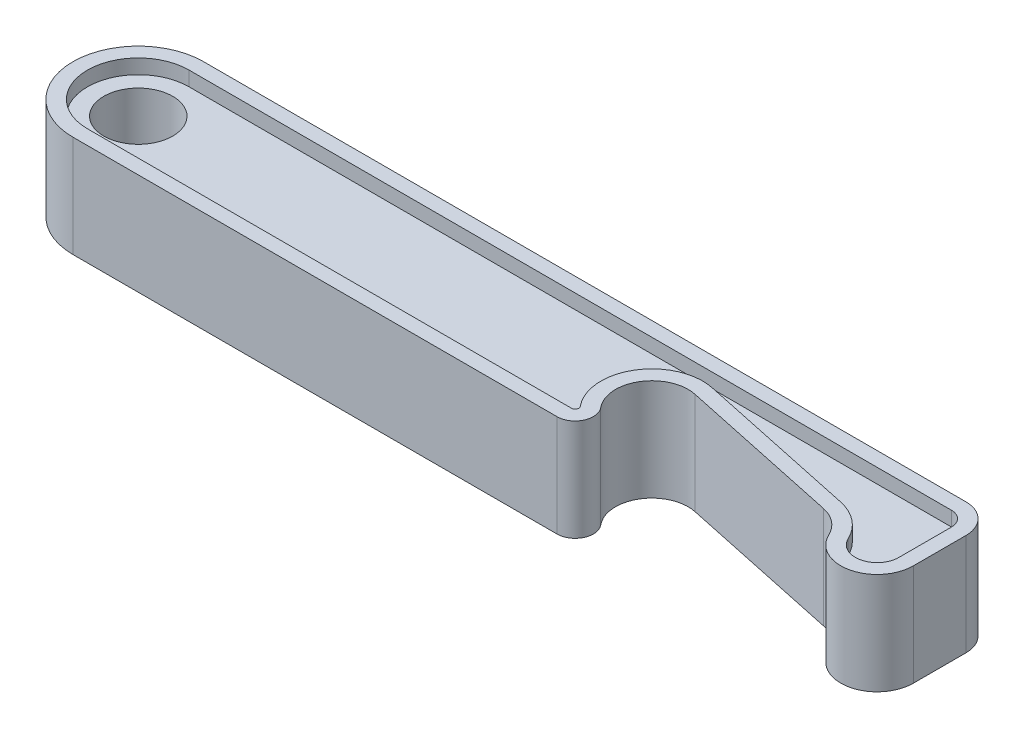
ISO-10303-21;
HEADER;
FILE_DESCRIPTION(('STEP AP214'),'2;1');
FILE_NAME('part.step','',(''),(''),'','','');
FILE_SCHEMA(('AUTOMOTIVE_DESIGN { 1 0 10303 214 1 1 1 1 }'));
ENDSEC;
DATA;
#1=APPLICATION_CONTEXT('core data for automotive mechanical design processes');
#2=APPLICATION_PROTOCOL_DEFINITION('international standard','automotive_design',2000,#1);
#3=PRODUCT_CONTEXT('',#1,'mechanical');
#4=PRODUCT('Part','Part','',(#3));
#5=PRODUCT_RELATED_PRODUCT_CATEGORY('part','',(#4));
#6=PRODUCT_DEFINITION_FORMATION('','',#4);
#7=PRODUCT_DEFINITION_CONTEXT('part definition',#1,'design');
#8=PRODUCT_DEFINITION('design','',#6,#7);
#9=PRODUCT_DEFINITION_SHAPE('','',#8);
#10=(LENGTH_UNIT() NAMED_UNIT(*) SI_UNIT(.MILLI.,.METRE.));
#11=(NAMED_UNIT(*) PLANE_ANGLE_UNIT() SI_UNIT($,.RADIAN.));
#12=(NAMED_UNIT(*) SI_UNIT($,.STERADIAN.) SOLID_ANGLE_UNIT());
#13=UNCERTAINTY_MEASURE_WITH_UNIT(LENGTH_MEASURE(1.E-05),#10,'distance_accuracy_value','');
#14=(GEOMETRIC_REPRESENTATION_CONTEXT(3) GLOBAL_UNCERTAINTY_ASSIGNED_CONTEXT((#13)) GLOBAL_UNIT_ASSIGNED_CONTEXT((#10,
#11,#12)) REPRESENTATION_CONTEXT('',''));
#15=CARTESIAN_POINT('',(0.,0.,0.));
#16=DIRECTION('',(0.,0.,1.));
#17=DIRECTION('',(1.,0.,0.));
#18=AXIS2_PLACEMENT_3D('',#15,#16,#17);
#19=CARTESIAN_POINT('',(-50.,7.,0.));
#20=DIRECTION('',(0.,-1.,0.));
#21=DIRECTION('',(0.,0.,-1.));
#22=AXIS2_PLACEMENT_3D('',#19,#20,#21);
#23=CYLINDRICAL_SURFACE('',#22,7.);
#24=DIRECTION('',(0.,-1.,0.));
#25=VECTOR('',#24,1.);
#26=CARTESIAN_POINT('',(-50.,7.,-7.));
#27=LINE('',#26,#25);
#28=CARTESIAN_POINT('',(-50.,-5.,-7.));
#29=VERTEX_POINT('',#28);
#30=CARTESIAN_POINT('',(-50.,-7.,-7.));
#31=VERTEX_POINT('',#30);
#32=EDGE_CURVE('E473',#29,#31,#27,.T.);
#33=ORIENTED_EDGE('',*,*,#32,.F.);
#34=CARTESIAN_POINT('',(-50.,-5.,0.));
#35=DIRECTION('',(0.,1.,0.));
#36=DIRECTION('',(0.,0.,1.));
#37=AXIS2_PLACEMENT_3D('',#34,#35,#36);
#38=CIRCLE('',#37,7.);
#39=CARTESIAN_POINT('',(-50.,-5.,7.));
#40=VERTEX_POINT('',#39);
#41=EDGE_CURVE('E291',#29,#40,#38,.T.);
#42=ORIENTED_EDGE('',*,*,#41,.T.);
#43=DIRECTION('',(0.,-1.,0.));
#44=VECTOR('',#43,1.);
#45=CARTESIAN_POINT('',(-50.,7.,7.));
#46=LINE('',#45,#44);
#47=CARTESIAN_POINT('',(-50.,-7.,7.));
#48=VERTEX_POINT('',#47);
#49=EDGE_CURVE('E369',#40,#48,#46,.T.);
#50=ORIENTED_EDGE('',*,*,#49,.T.);
#51=CARTESIAN_POINT('',(-50.,-7.,0.));
#52=DIRECTION('',(0.,1.,0.));
#53=DIRECTION('',(0.,0.,1.));
#54=AXIS2_PLACEMENT_3D('',#51,#52,#53);
#55=CIRCLE('',#54,7.);
#56=EDGE_CURVE('E285',#31,#48,#55,.T.);
#57=ORIENTED_EDGE('',*,*,#56,.F.);
#58=EDGE_LOOP('',(#33,#42,#50,#57));
#59=FACE_BOUND('',#58,.T.);
#60=ADVANCED_FACE('F45',(#59),#23,.F.);
#61=CARTESIAN_POINT('',(0.,7.,-7.));
#62=DIRECTION('',(0.,0.,-1.));
#63=DIRECTION('',(-1.,0.,0.));
#64=AXIS2_PLACEMENT_3D('',#61,#62,#63);
#65=PLANE('',#64);
#66=DIRECTION('',(1.,0.,0.));
#67=VECTOR('',#66,1.);
#68=CARTESIAN_POINT('',(0.,-5.,-7.));
#69=LINE('',#68,#67);
#70=CARTESIAN_POINT('',(55.,-5.,-7.));
#71=VERTEX_POINT('',#70);
#72=EDGE_CURVE('E289',#29,#71,#69,.T.);
#73=ORIENTED_EDGE('',*,*,#72,.F.);
#74=ORIENTED_EDGE('',*,*,#32,.T.);
#75=DIRECTION('',(1.,0.,0.));
#76=VECTOR('',#75,1.);
#77=CARTESIAN_POINT('',(0.,-7.,-7.));
#78=LINE('',#77,#76);
#79=CARTESIAN_POINT('',(55.,-7.,-7.));
#80=VERTEX_POINT('',#79);
#81=EDGE_CURVE('E372',#31,#80,#78,.T.);
#82=ORIENTED_EDGE('',*,*,#81,.T.);
#83=DIRECTION('',(0.,-1.,0.));
#84=VECTOR('',#83,1.);
#85=CARTESIAN_POINT('',(55.,7.,-7.));
#86=LINE('',#85,#84);
#87=EDGE_CURVE('E471',#71,#80,#86,.T.);
#88=ORIENTED_EDGE('',*,*,#87,.F.);
#89=EDGE_LOOP('',(#73,#74,#82,#88));
#90=FACE_BOUND('',#89,.T.);
#91=ADVANCED_FACE('F483',(#90),#65,.F.);
#92=CARTESIAN_POINT('',(55.,7.,-5.));
#93=DIRECTION('',(0.,-1.,0.));
#94=DIRECTION('',(0.,0.,-1.));
#95=AXIS2_PLACEMENT_3D('',#92,#93,#94);
#96=CYLINDRICAL_SURFACE('',#95,2.);
#97=DIRECTION('',(0.,-1.,0.));
#98=VECTOR('',#97,1.);
#99=CARTESIAN_POINT('',(57.,7.,-5.));
#100=LINE('',#99,#98);
#101=CARTESIAN_POINT('',(57.,-5.,-5.));
#102=VERTEX_POINT('',#101);
#103=CARTESIAN_POINT('',(57.,-7.,-5.));
#104=VERTEX_POINT('',#103);
#105=EDGE_CURVE('E468',#102,#104,#100,.T.);
#106=ORIENTED_EDGE('',*,*,#105,.F.);
#107=CARTESIAN_POINT('',(55.,-5.,-5.));
#108=DIRECTION('',(0.,1.,0.));
#109=DIRECTION('',(0.,0.,1.));
#110=AXIS2_PLACEMENT_3D('',#107,#108,#109);
#111=CIRCLE('',#110,2.);
#112=EDGE_CURVE('E313',#102,#71,#111,.T.);
#113=ORIENTED_EDGE('',*,*,#112,.T.);
#114=ORIENTED_EDGE('',*,*,#87,.T.);
#115=CARTESIAN_POINT('',(55.,-7.,-5.));
#116=DIRECTION('',(0.,1.,0.));
#117=DIRECTION('',(0.,0.,1.));
#118=AXIS2_PLACEMENT_3D('',#115,#116,#117);
#119=CIRCLE('',#118,2.);
#120=EDGE_CURVE('E375',#104,#80,#119,.T.);
#121=ORIENTED_EDGE('',*,*,#120,.F.);
#122=EDGE_LOOP('',(#106,#113,#114,#121));
#123=FACE_BOUND('',#122,.T.);
#124=ADVANCED_FACE('F479',(#123),#96,.F.);
#125=CARTESIAN_POINT('',(57.,7.,0.));
#126=DIRECTION('',(1.,0.,0.));
#127=DIRECTION('',(0.,0.,-1.));
#128=AXIS2_PLACEMENT_3D('',#125,#126,#127);
#129=PLANE('',#128);
#130=DIRECTION('',(0.,0.,1.));
#131=VECTOR('',#130,1.);
#132=CARTESIAN_POINT('',(57.,-5.,0.));
#133=LINE('',#132,#131);
#134=CARTESIAN_POINT('',(57.,-5.,2.24951352484519));
#135=VERTEX_POINT('',#134);
#136=EDGE_CURVE('E311',#102,#135,#133,.T.);
#137=ORIENTED_EDGE('',*,*,#136,.F.);
#138=ORIENTED_EDGE('',*,*,#105,.T.);
#139=DIRECTION('',(0.,0.,1.));
#140=VECTOR('',#139,1.);
#141=CARTESIAN_POINT('',(57.,-7.,0.));
#142=LINE('',#141,#140);
#143=CARTESIAN_POINT('',(57.,-7.,2.24951352484519));
#144=VERTEX_POINT('',#143);
#145=EDGE_CURVE('E378',#104,#144,#142,.T.);
#146=ORIENTED_EDGE('',*,*,#145,.T.);
#147=DIRECTION('',(0.,-1.,0.));
#148=VECTOR('',#147,1.);
#149=CARTESIAN_POINT('',(57.,7.,2.24951352484519));
#150=LINE('',#149,#148);
#151=EDGE_CURVE('E464',#135,#144,#150,.T.);
#152=ORIENTED_EDGE('',*,*,#151,.F.);
#153=EDGE_LOOP('',(#137,#138,#146,#152));
#154=FACE_BOUND('',#153,.T.);
#155=ADVANCED_FACE('F495',(#154),#129,.F.);
#156=CARTESIAN_POINT('',(54.,7.,2.24951352484519));
#157=DIRECTION('',(0.,-1.,0.));
#158=DIRECTION('',(0.,0.,-1.));
#159=AXIS2_PLACEMENT_3D('',#156,#157,#158);
#160=CYLINDRICAL_SURFACE('',#159,3.00000000000001);
#161=DIRECTION('',(0.,-1.,0.));
#162=VECTOR('',#161,1.);
#163=CARTESIAN_POINT('',(51.284488478167,7.,3.52465946739163));
#164=LINE('',#163,#162);
#165=CARTESIAN_POINT('',(51.284488478167,-5.,3.52465946739163));
#166=VERTEX_POINT('',#165);
#167=CARTESIAN_POINT('',(51.284488478167,-7.,3.52465946739163));
#168=VERTEX_POINT('',#167);
#169=EDGE_CURVE('E460',#166,#168,#164,.T.);
#170=ORIENTED_EDGE('',*,*,#169,.F.);
#171=CARTESIAN_POINT('',(54.,-5.,2.24951352484519));
#172=DIRECTION('',(0.,1.,0.));
#173=DIRECTION('',(0.,0.,1.));
#174=AXIS2_PLACEMENT_3D('',#171,#172,#173);
#175=CIRCLE('',#174,3.00000000000001);
#176=EDGE_CURVE('E308',#166,#135,#175,.T.);
#177=ORIENTED_EDGE('',*,*,#176,.T.);
#178=ORIENTED_EDGE('',*,*,#151,.T.);
#179=CARTESIAN_POINT('',(54.,-7.,2.24951352484519));
#180=DIRECTION('',(0.,1.,0.));
#181=DIRECTION('',(0.,0.,1.));
#182=AXIS2_PLACEMENT_3D('',#179,#180,#181);
#183=CIRCLE('',#182,3.00000000000001);
#184=EDGE_CURVE('E381',#168,#144,#183,.T.);
#185=ORIENTED_EDGE('',*,*,#184,.F.);
#186=EDGE_LOOP('',(#170,#177,#178,#185));
#187=FACE_BOUND('',#186,.T.);
#188=ADVANCED_FACE('F501',(#187),#160,.F.);
#189=CARTESIAN_POINT('',(44.9482949272236,7.,6.5));
#190=DIRECTION('',(0.,-1.,0.));
#191=DIRECTION('',(0.,0.,-1.));
#192=AXIS2_PLACEMENT_3D('',#189,#190,#191);
#193=CYLINDRICAL_SURFACE('',#192,7.);
#194=CARTESIAN_POINT('',(44.9482949272236,-5.,6.5));
#195=DIRECTION('',(0.,1.,0.));
#196=DIRECTION('',(0.,0.,1.));
#197=AXIS2_PLACEMENT_3D('',#194,#195,#196);
#198=CIRCLE('',#197,7.);
#199=CARTESIAN_POINT('',(46.4036767629479,-5.,-0.347033205136637));
#200=VERTEX_POINT('',#199);
#201=EDGE_CURVE('E306',#166,#200,#198,.T.);
#202=ORIENTED_EDGE('',*,*,#201,.F.);
#203=ORIENTED_EDGE('',*,*,#169,.T.);
#204=CARTESIAN_POINT('',(44.9482949272236,-7.,6.5));
#205=DIRECTION('',(0.,1.,0.));
#206=DIRECTION('',(0.,0.,1.));
#207=AXIS2_PLACEMENT_3D('',#204,#205,#206);
#208=CIRCLE('',#207,7.);
#209=CARTESIAN_POINT('',(46.4036767629479,-7.,-0.347033205136637));
#210=VERTEX_POINT('',#209);
#211=EDGE_CURVE('E384',#168,#210,#208,.T.);
#212=ORIENTED_EDGE('',*,*,#211,.T.);
#213=DIRECTION('',(0.,-1.,0.));
#214=VECTOR('',#213,1.);
#215=CARTESIAN_POINT('',(46.4036767629479,7.,-0.347033205136637));
#216=LINE('',#215,#214);
#217=EDGE_CURVE('E456',#200,#210,#216,.T.);
#218=ORIENTED_EDGE('',*,*,#217,.F.);
#219=EDGE_LOOP('',(#202,#203,#212,#218));
#220=FACE_BOUND('',#219,.T.);
#221=ADVANCED_FACE('F503',(#220),#193,.T.);
#222=CARTESIAN_POINT('',(2.07647987956723,7.,-9.76906976313817));
#223=DIRECTION('',(0.20791169081776,0.,-0.978147600733806));
#224=DIRECTION('',(-0.978147600733806,0.,-0.20791169081776));
#225=AXIS2_PLACEMENT_3D('',#222,#223,#224);
#226=PLANE('',#225);
#227=DIRECTION('',(0.,-1.,0.));
#228=VECTOR('',#227,1.);
#229=CARTESIAN_POINT('',(23.9036767629479,7.,-5.12955584271215));
#230=LINE('',#229,#228);
#231=CARTESIAN_POINT('',(23.9036767629479,-5.,-5.12955584271215));
#232=VERTEX_POINT('',#231);
#233=CARTESIAN_POINT('',(23.9036767629479,-7.,-5.12955584271215));
#234=VERTEX_POINT('',#233);
#235=EDGE_CURVE('E452',#232,#234,#230,.T.);
#236=ORIENTED_EDGE('',*,*,#235,.F.);
#237=DIRECTION('',(0.978147600733806,0.,0.20791169081776));
#238=VECTOR('',#237,1.);
#239=CARTESIAN_POINT('',(2.07647987956723,-5.,-9.76906976313817));
#240=LINE('',#239,#238);
#241=EDGE_CURVE('E303',#232,#200,#240,.T.);
#242=ORIENTED_EDGE('',*,*,#241,.T.);
#243=ORIENTED_EDGE('',*,*,#217,.T.);
#244=DIRECTION('',(0.978147600733806,0.,0.20791169081776));
#245=VECTOR('',#244,1.);
#246=CARTESIAN_POINT('',(2.07647987956723,-7.,-9.76906976313817));
#247=LINE('',#246,#245);
#248=EDGE_CURVE('E387',#234,#210,#247,.T.);
#249=ORIENTED_EDGE('',*,*,#248,.F.);
#250=EDGE_LOOP('',(#236,#242,#243,#249));
#251=FACE_BOUND('',#250,.T.);
#252=ADVANCED_FACE('F509',(#251),#226,.T.);
#253=CARTESIAN_POINT('',(22.4482949272236,7.,1.71747736242449));
#254=DIRECTION('',(0.,-1.,0.));
#255=DIRECTION('',(0.,0.,-1.));
#256=AXIS2_PLACEMENT_3D('',#253,#254,#255);
#257=CYLINDRICAL_SURFACE('',#256,7.);
#258=DIRECTION('',(0.,-1.,0.));
#259=VECTOR('',#258,1.);
#260=CARTESIAN_POINT('',(17.0561254873655,7.,6.18116515749496));
#261=LINE('',#260,#259);
#262=CARTESIAN_POINT('',(17.0561254873655,-5.,6.18116515749496));
#263=VERTEX_POINT('',#262);
#264=CARTESIAN_POINT('',(17.0561254873655,-7.,6.18116515749496));
#265=VERTEX_POINT('',#264);
#266=EDGE_CURVE('E254',#263,#265,#261,.T.);
#267=ORIENTED_EDGE('',*,*,#266,.F.);
#268=CARTESIAN_POINT('',(22.4482949272236,-5.,1.71747736242449));
#269=DIRECTION('',(0.,1.,0.));
#270=DIRECTION('',(0.,0.,1.));
#271=AXIS2_PLACEMENT_3D('',#268,#269,#270);
#272=CIRCLE('',#271,7.);
#273=EDGE_CURVE('E300',#263,#232,#272,.F.);
#274=ORIENTED_EDGE('',*,*,#273,.T.);
#275=ORIENTED_EDGE('',*,*,#235,.T.);
#276=CARTESIAN_POINT('',(22.4482949272236,-7.,1.71747736242449));
#277=DIRECTION('',(0.,1.,0.));
#278=DIRECTION('',(0.,0.,1.));
#279=AXIS2_PLACEMENT_3D('',#276,#277,#278);
#280=CIRCLE('',#279,7.);
#281=EDGE_CURVE('E390',#265,#234,#280,.F.);
#282=ORIENTED_EDGE('',*,*,#281,.F.);
#283=EDGE_LOOP('',(#267,#274,#275,#282));
#284=FACE_BOUND('',#283,.T.);
#285=ADVANCED_FACE('F512',(#284),#257,.T.);
#286=CARTESIAN_POINT('',(16.6709705273757,7.,6.5));
#287=DIRECTION('',(0.,-1.,0.));
#288=DIRECTION('',(0.,0.,-1.));
#289=AXIS2_PLACEMENT_3D('',#286,#287,#288);
#290=CYLINDRICAL_SURFACE('',#289,0.500000000000001);
#291=DIRECTION('',(0.,-1.,0.));
#292=VECTOR('',#291,1.);
#293=CARTESIAN_POINT('',(16.6709705273757,7.,7.));
#294=LINE('',#293,#292);
#295=CARTESIAN_POINT('',(16.6709705273757,-5.,7.));
#296=VERTEX_POINT('',#295);
#297=CARTESIAN_POINT('',(16.6709705273757,-7.,7.));
#298=VERTEX_POINT('',#297);
#299=EDGE_CURVE('E255',#296,#298,#294,.T.);
#300=ORIENTED_EDGE('',*,*,#299,.F.);
#301=CARTESIAN_POINT('',(16.6709705273757,-5.,6.5));
#302=DIRECTION('',(0.,1.,0.));
#303=DIRECTION('',(0.,0.,1.));
#304=AXIS2_PLACEMENT_3D('',#301,#302,#303);
#305=CIRCLE('',#304,0.500000000000001);
#306=EDGE_CURVE('E297',#296,#263,#305,.T.);
#307=ORIENTED_EDGE('',*,*,#306,.T.);
#308=ORIENTED_EDGE('',*,*,#266,.T.);
#309=CARTESIAN_POINT('',(16.6709705273757,-7.,6.5));
#310=DIRECTION('',(0.,1.,0.));
#311=DIRECTION('',(0.,0.,1.));
#312=AXIS2_PLACEMENT_3D('',#309,#310,#311);
#313=CIRCLE('',#312,0.500000000000001);
#314=EDGE_CURVE('E393',#298,#265,#313,.T.);
#315=ORIENTED_EDGE('',*,*,#314,.F.);
#316=EDGE_LOOP('',(#300,#307,#308,#315));
#317=FACE_BOUND('',#316,.T.);
#318=ADVANCED_FACE('F516',(#317),#290,.F.);
#319=CARTESIAN_POINT('',(0.,7.,7.));
#320=DIRECTION('',(0.,0.,-1.));
#321=DIRECTION('',(-1.,0.,0.));
#322=AXIS2_PLACEMENT_3D('',#319,#320,#321);
#323=PLANE('',#322);
#324=ORIENTED_EDGE('',*,*,#49,.F.);
#325=DIRECTION('',(1.,0.,0.));
#326=VECTOR('',#325,1.);
#327=CARTESIAN_POINT('',(0.,-5.,7.));
#328=LINE('',#327,#326);
#329=EDGE_CURVE('E294',#40,#296,#328,.T.);
#330=ORIENTED_EDGE('',*,*,#329,.T.);
#331=ORIENTED_EDGE('',*,*,#299,.T.);
#332=DIRECTION('',(1.,0.,0.));
#333=VECTOR('',#332,1.);
#334=CARTESIAN_POINT('',(0.,-7.,7.));
#335=LINE('',#334,#333);
#336=EDGE_CURVE('E396',#48,#298,#335,.T.);
#337=ORIENTED_EDGE('',*,*,#336,.F.);
#338=EDGE_LOOP('',(#324,#330,#331,#337));
#339=FACE_BOUND('',#338,.T.);
#340=ADVANCED_FACE('F519',(#339),#323,.T.);
#341=CARTESIAN_POINT('',(44.9482949272236,7.,6.5));
#342=DIRECTION('',(0.,-1.,0.));
#343=DIRECTION('',(0.,0.,-1.));
#344=AXIS2_PLACEMENT_3D('',#341,#342,#343);
#345=CYLINDRICAL_SURFACE('',#344,5.);
#346=CARTESIAN_POINT('',(44.9482949272236,-7.,6.5));
#347=DIRECTION('',(0.,1.,0.));
#348=DIRECTION('',(0.,0.,1.));
#349=AXIS2_PLACEMENT_3D('',#346,#347,#348);
#350=CIRCLE('',#349,5.);
#351=CARTESIAN_POINT('',(49.4741474636118,-7.,4.3747567624226));
#352=VERTEX_POINT('',#351);
#353=CARTESIAN_POINT('',(45.9878533813124,-7.,1.60926199633097));
#354=VERTEX_POINT('',#353);
#355=EDGE_CURVE('E399',#352,#354,#350,.T.);
#356=ORIENTED_EDGE('',*,*,#355,.F.);
#357=DIRECTION('',(0.,-1.,0.));
#358=VECTOR('',#357,1.);
#359=CARTESIAN_POINT('',(49.4741474636118,7.,4.3747567624226));
#360=LINE('',#359,#358);
#361=CARTESIAN_POINT('',(49.4741474636118,7.,4.3747567624226));
#362=VERTEX_POINT('',#361);
#363=EDGE_CURVE('E11',#362,#352,#360,.T.);
#364=ORIENTED_EDGE('',*,*,#363,.F.);
#365=CARTESIAN_POINT('',(44.9482949272236,7.,6.5));
#366=DIRECTION('',(0.,1.,0.));
#367=DIRECTION('',(0.,0.,1.));
#368=AXIS2_PLACEMENT_3D('',#365,#366,#367);
#369=CIRCLE('',#368,5.);
#370=CARTESIAN_POINT('',(45.9878533813124,7.,1.60926199633097));
#371=VERTEX_POINT('',#370);
#372=EDGE_CURVE('E342',#362,#371,#369,.T.);
#373=ORIENTED_EDGE('',*,*,#372,.T.);
#374=DIRECTION('',(0.,-1.,0.));
#375=VECTOR('',#374,1.);
#376=CARTESIAN_POINT('',(45.9878533813124,7.,1.60926199633097));
#377=LINE('',#376,#375);
#378=EDGE_CURVE('E428',#371,#354,#377,.T.);
#379=ORIENTED_EDGE('',*,*,#378,.T.);
#380=EDGE_LOOP('',(#356,#364,#373,#379));
#381=FACE_BOUND('',#380,.T.);
#382=ADVANCED_FACE('F572',(#381),#345,.F.);
#383=CARTESIAN_POINT('',(54.,7.,2.24951352484519));
#384=DIRECTION('',(0.,-1.,0.));
#385=DIRECTION('',(0.,0.,-1.));
#386=AXIS2_PLACEMENT_3D('',#383,#384,#385);
#387=CYLINDRICAL_SURFACE('',#386,5.00000000000001);
#388=CARTESIAN_POINT('',(54.,-7.,2.24951352484519));
#389=DIRECTION('',(0.,1.,0.));
#390=DIRECTION('',(0.,0.,1.));
#391=AXIS2_PLACEMENT_3D('',#388,#389,#390);
#392=CIRCLE('',#391,5.00000000000001);
#393=CARTESIAN_POINT('',(59.,-7.,2.24951352484519));
#394=VERTEX_POINT('',#393);
#395=EDGE_CURVE('E402',#352,#394,#392,.T.);
#396=ORIENTED_EDGE('',*,*,#395,.T.);
#397=DIRECTION('',(0.,-1.,0.));
#398=VECTOR('',#397,1.);
#399=CARTESIAN_POINT('',(59.,7.,2.24951352484519));
#400=LINE('',#399,#398);
#401=CARTESIAN_POINT('',(59.,7.,2.24951352484519));
#402=VERTEX_POINT('',#401);
#403=EDGE_CURVE('E54',#402,#394,#400,.T.);
#404=ORIENTED_EDGE('',*,*,#403,.F.);
#405=CARTESIAN_POINT('',(54.,7.,2.24951352484519));
#406=DIRECTION('',(0.,1.,0.));
#407=DIRECTION('',(0.,0.,1.));
#408=AXIS2_PLACEMENT_3D('',#405,#406,#407);
#409=CIRCLE('',#408,5.00000000000001);
#410=EDGE_CURVE('E345',#362,#402,#409,.T.);
#411=ORIENTED_EDGE('',*,*,#410,.F.);
#412=ORIENTED_EDGE('',*,*,#363,.T.);
#413=EDGE_LOOP('',(#396,#404,#411,#412));
#414=FACE_BOUND('',#413,.T.);
#415=ADVANCED_FACE('F568',(#414),#387,.T.);
#416=CARTESIAN_POINT('',(59.,7.,0.));
#417=DIRECTION('',(1.,0.,0.));
#418=DIRECTION('',(0.,0.,-1.));
#419=AXIS2_PLACEMENT_3D('',#416,#417,#418);
#420=PLANE('',#419);
#421=DIRECTION('',(0.,0.,1.));
#422=VECTOR('',#421,1.);
#423=CARTESIAN_POINT('',(59.,-7.,0.));
#424=LINE('',#423,#422);
#425=CARTESIAN_POINT('',(59.,-7.,-5.));
#426=VERTEX_POINT('',#425);
#427=EDGE_CURVE('E405',#426,#394,#424,.T.);
#428=ORIENTED_EDGE('',*,*,#427,.F.);
#429=DIRECTION('',(0.,-1.,0.));
#430=VECTOR('',#429,1.);
#431=CARTESIAN_POINT('',(59.,7.,-5.));
#432=LINE('',#431,#430);
#433=CARTESIAN_POINT('',(59.,7.,-5.));
#434=VERTEX_POINT('',#433);
#435=EDGE_CURVE('E446',#434,#426,#432,.T.);
#436=ORIENTED_EDGE('',*,*,#435,.F.);
#437=DIRECTION('',(0.,0.,1.));
#438=VECTOR('',#437,1.);
#439=CARTESIAN_POINT('',(59.,7.,0.));
#440=LINE('',#439,#438);
#441=EDGE_CURVE('E347',#434,#402,#440,.T.);
#442=ORIENTED_EDGE('',*,*,#441,.T.);
#443=ORIENTED_EDGE('',*,*,#403,.T.);
#444=EDGE_LOOP('',(#428,#436,#442,#443));
#445=FACE_BOUND('',#444,.T.);
#446=ADVANCED_FACE('F564',(#445),#420,.T.);
#447=CARTESIAN_POINT('',(55.,7.,-5.));
#448=DIRECTION('',(0.,-1.,0.));
#449=DIRECTION('',(0.,0.,-1.));
#450=AXIS2_PLACEMENT_3D('',#447,#448,#449);
#451=CYLINDRICAL_SURFACE('',#450,4.);
#452=CARTESIAN_POINT('',(55.,-7.,-5.));
#453=DIRECTION('',(0.,1.,0.));
#454=DIRECTION('',(0.,0.,1.));
#455=AXIS2_PLACEMENT_3D('',#452,#453,#454);
#456=CIRCLE('',#455,4.);
#457=CARTESIAN_POINT('',(55.,-7.,-9.));
#458=VERTEX_POINT('',#457);
#459=EDGE_CURVE('E408',#426,#458,#456,.T.);
#460=ORIENTED_EDGE('',*,*,#459,.T.);
#461=DIRECTION('',(0.,-1.,0.));
#462=VECTOR('',#461,1.);
#463=CARTESIAN_POINT('',(55.,7.,-9.));
#464=LINE('',#463,#462);
#465=CARTESIAN_POINT('',(55.,7.,-9.));
#466=VERTEX_POINT('',#465);
#467=EDGE_CURVE('E444',#466,#458,#464,.T.);
#468=ORIENTED_EDGE('',*,*,#467,.F.);
#469=CARTESIAN_POINT('',(55.,7.,-5.));
#470=DIRECTION('',(0.,1.,0.));
#471=DIRECTION('',(0.,0.,1.));
#472=AXIS2_PLACEMENT_3D('',#469,#470,#471);
#473=CIRCLE('',#472,4.);
#474=EDGE_CURVE('E350',#434,#466,#473,.T.);
#475=ORIENTED_EDGE('',*,*,#474,.F.);
#476=ORIENTED_EDGE('',*,*,#435,.T.);
#477=EDGE_LOOP('',(#460,#468,#475,#476));
#478=FACE_BOUND('',#477,.T.);
#479=ADVANCED_FACE('F560',(#478),#451,.T.);
#480=CARTESIAN_POINT('',(0.,7.,-9.));
#481=DIRECTION('',(0.,0.,-1.));
#482=DIRECTION('',(-1.,0.,0.));
#483=AXIS2_PLACEMENT_3D('',#480,#481,#482);
#484=PLANE('',#483);
#485=DIRECTION('',(1.,0.,0.));
#486=VECTOR('',#485,1.);
#487=CARTESIAN_POINT('',(0.,-7.,-9.));
#488=LINE('',#487,#486);
#489=CARTESIAN_POINT('',(-50.,-7.,-9.));
#490=VERTEX_POINT('',#489);
#491=EDGE_CURVE('E411',#490,#458,#488,.T.);
#492=ORIENTED_EDGE('',*,*,#491,.F.);
#493=DIRECTION('',(0.,-1.,0.));
#494=VECTOR('',#493,1.);
#495=CARTESIAN_POINT('',(-50.,7.,-9.));
#496=LINE('',#495,#494);
#497=CARTESIAN_POINT('',(-50.,7.,-9.));
#498=VERTEX_POINT('',#497);
#499=EDGE_CURVE('E442',#498,#490,#496,.T.);
#500=ORIENTED_EDGE('',*,*,#499,.F.);
#501=DIRECTION('',(1.,0.,0.));
#502=VECTOR('',#501,1.);
#503=CARTESIAN_POINT('',(0.,7.,-9.));
#504=LINE('',#503,#502);
#505=EDGE_CURVE('E352',#498,#466,#504,.T.);
#506=ORIENTED_EDGE('',*,*,#505,.T.);
#507=ORIENTED_EDGE('',*,*,#467,.T.);
#508=EDGE_LOOP('',(#492,#500,#506,#507));
#509=FACE_BOUND('',#508,.T.);
#510=ADVANCED_FACE('F556',(#509),#484,.T.);
#511=CARTESIAN_POINT('',(-50.,7.,0.));
#512=DIRECTION('',(0.,-1.,0.));
#513=DIRECTION('',(0.,0.,-1.));
#514=AXIS2_PLACEMENT_3D('',#511,#512,#513);
#515=CYLINDRICAL_SURFACE('',#514,9.);
#516=CARTESIAN_POINT('',(-50.,-7.,0.));
#517=DIRECTION('',(0.,1.,0.));
#518=DIRECTION('',(0.,0.,1.));
#519=AXIS2_PLACEMENT_3D('',#516,#517,#518);
#520=CIRCLE('',#519,9.);
#521=CARTESIAN_POINT('',(-50.,-7.,9.));
#522=VERTEX_POINT('',#521);
#523=EDGE_CURVE('E414',#490,#522,#520,.T.);
#524=ORIENTED_EDGE('',*,*,#523,.T.);
#525=DIRECTION('',(0.,-1.,0.));
#526=VECTOR('',#525,1.);
#527=CARTESIAN_POINT('',(-50.,7.,9.));
#528=LINE('',#527,#526);
#529=CARTESIAN_POINT('',(-50.,7.,9.));
#530=VERTEX_POINT('',#529);
#531=EDGE_CURVE('E439',#530,#522,#528,.T.);
#532=ORIENTED_EDGE('',*,*,#531,.F.);
#533=CARTESIAN_POINT('',(-50.,7.,0.));
#534=DIRECTION('',(0.,1.,0.));
#535=DIRECTION('',(0.,0.,1.));
#536=AXIS2_PLACEMENT_3D('',#533,#534,#535);
#537=CIRCLE('',#536,9.);
#538=EDGE_CURVE('E355',#498,#530,#537,.T.);
#539=ORIENTED_EDGE('',*,*,#538,.F.);
#540=ORIENTED_EDGE('',*,*,#499,.T.);
#541=EDGE_LOOP('',(#524,#532,#539,#540));
#542=FACE_BOUND('',#541,.T.);
#543=ADVANCED_FACE('F552',(#542),#515,.T.);
#544=CARTESIAN_POINT('',(0.,7.,9.));
#545=DIRECTION('',(0.,0.,-1.));
#546=DIRECTION('',(-1.,0.,0.));
#547=AXIS2_PLACEMENT_3D('',#544,#545,#546);
#548=PLANE('',#547);
#549=DIRECTION('',(1.,0.,0.));
#550=VECTOR('',#549,1.);
#551=CARTESIAN_POINT('',(0.,-7.,9.));
#552=LINE('',#551,#550);
#553=CARTESIAN_POINT('',(16.6709705273757,-7.,9.));
#554=VERTEX_POINT('',#553);
#555=EDGE_CURVE('E417',#522,#554,#552,.T.);
#556=ORIENTED_EDGE('',*,*,#555,.T.);
#557=DIRECTION('',(0.,-1.,0.));
#558=VECTOR('',#557,1.);
#559=CARTESIAN_POINT('',(16.6709705273757,7.,9.));
#560=LINE('',#559,#558);
#561=CARTESIAN_POINT('',(16.6709705273757,7.,9.));
#562=VERTEX_POINT('',#561);
#563=EDGE_CURVE('E436',#562,#554,#560,.T.);
#564=ORIENTED_EDGE('',*,*,#563,.F.);
#565=DIRECTION('',(1.,0.,0.));
#566=VECTOR('',#565,1.);
#567=CARTESIAN_POINT('',(0.,7.,9.));
#568=LINE('',#567,#566);
#569=EDGE_CURVE('E358',#530,#562,#568,.T.);
#570=ORIENTED_EDGE('',*,*,#569,.F.);
#571=ORIENTED_EDGE('',*,*,#531,.T.);
#572=EDGE_LOOP('',(#556,#564,#570,#571));
#573=FACE_BOUND('',#572,.T.);
#574=ADVANCED_FACE('F543',(#573),#548,.F.);
#575=CARTESIAN_POINT('',(16.6709705273757,7.,6.5));
#576=DIRECTION('',(0.,-1.,0.));
#577=DIRECTION('',(0.,0.,-1.));
#578=AXIS2_PLACEMENT_3D('',#575,#576,#577);
#579=CYLINDRICAL_SURFACE('',#578,2.5);
#580=CARTESIAN_POINT('',(16.6709705273757,-7.,6.5));
#581=DIRECTION('',(0.,1.,0.));
#582=DIRECTION('',(0.,0.,1.));
#583=AXIS2_PLACEMENT_3D('',#580,#581,#582);
#584=CIRCLE('',#583,2.5);
#585=CARTESIAN_POINT('',(18.596745327325,-7.,4.90582578747483));
#586=VERTEX_POINT('',#585);
#587=EDGE_CURVE('E420',#554,#586,#584,.T.);
#588=ORIENTED_EDGE('',*,*,#587,.T.);
#589=DIRECTION('',(0.,-1.,0.));
#590=VECTOR('',#589,1.);
#591=CARTESIAN_POINT('',(18.596745327325,7.,4.90582578747483));
#592=LINE('',#591,#590);
#593=CARTESIAN_POINT('',(18.596745327325,7.,4.90582578747483));
#594=VERTEX_POINT('',#593);
#595=EDGE_CURVE('E433',#594,#586,#592,.T.);
#596=ORIENTED_EDGE('',*,*,#595,.F.);
#597=CARTESIAN_POINT('',(16.6709705273757,7.,6.5));
#598=DIRECTION('',(0.,1.,0.));
#599=DIRECTION('',(0.,0.,1.));
#600=AXIS2_PLACEMENT_3D('',#597,#598,#599);
#601=CIRCLE('',#600,2.5);
#602=EDGE_CURVE('E361',#562,#594,#601,.T.);
#603=ORIENTED_EDGE('',*,*,#602,.F.);
#604=ORIENTED_EDGE('',*,*,#563,.T.);
#605=EDGE_LOOP('',(#588,#596,#603,#604));
#606=FACE_BOUND('',#605,.T.);
#607=ADVANCED_FACE('F536',(#606),#579,.T.);
#608=CARTESIAN_POINT('',(22.4482949272236,7.,1.71747736242449));
#609=DIRECTION('',(0.,-1.,0.));
#610=DIRECTION('',(0.,0.,-1.));
#611=AXIS2_PLACEMENT_3D('',#608,#609,#610);
#612=CYLINDRICAL_SURFACE('',#611,5.);
#613=CARTESIAN_POINT('',(22.4482949272236,-7.,1.71747736242449));
#614=DIRECTION('',(0.,1.,0.));
#615=DIRECTION('',(0.,0.,1.));
#616=AXIS2_PLACEMENT_3D('',#613,#614,#615);
#617=CIRCLE('',#616,5.);
#618=CARTESIAN_POINT('',(23.4878533813124,-7.,-3.17326064124454));
#619=VERTEX_POINT('',#618);
#620=EDGE_CURVE('E423',#586,#619,#617,.F.);
#621=ORIENTED_EDGE('',*,*,#620,.T.);
#622=DIRECTION('',(0.,-1.,0.));
#623=VECTOR('',#622,1.);
#624=CARTESIAN_POINT('',(23.4878533813124,7.,-3.17326064124454));
#625=LINE('',#624,#623);
#626=CARTESIAN_POINT('',(23.4878533813124,7.,-3.17326064124454));
#627=VERTEX_POINT('',#626);
#628=EDGE_CURVE('E430',#627,#619,#625,.T.);
#629=ORIENTED_EDGE('',*,*,#628,.F.);
#630=CARTESIAN_POINT('',(22.4482949272236,7.,1.71747736242449));
#631=DIRECTION('',(0.,1.,0.));
#632=DIRECTION('',(0.,0.,1.));
#633=AXIS2_PLACEMENT_3D('',#630,#631,#632);
#634=CIRCLE('',#633,5.);
#635=EDGE_CURVE('E364',#594,#627,#634,.F.);
#636=ORIENTED_EDGE('',*,*,#635,.F.);
#637=ORIENTED_EDGE('',*,*,#595,.T.);
#638=EDGE_LOOP('',(#621,#629,#636,#637));
#639=FACE_BOUND('',#638,.T.);
#640=ADVANCED_FACE('F529',(#639),#612,.F.);
#641=CARTESIAN_POINT('',(-50.,5.,0.));
#642=DIRECTION('',(0.,1.,0.));
#643=DIRECTION('',(0.,0.,1.));
#644=AXIS2_PLACEMENT_3D('',#641,#642,#643);
#645=CIRCLE('',#644,7.);
#646=CARTESIAN_POINT('',(-50.,5.,-7.));
#647=VERTEX_POINT('',#646);
#648=CARTESIAN_POINT('',(-50.,5.,7.));
#649=VERTEX_POINT('',#648);
#650=EDGE_CURVE('E62',#647,#649,#645,.T.);
#651=ORIENTED_EDGE('',*,*,#650,.F.);
#652=CARTESIAN_POINT('',(-50.,7.,-7.));
#653=VERTEX_POINT('',#652);
#654=EDGE_CURVE('E49',#653,#647,#27,.T.);
#655=ORIENTED_EDGE('',*,*,#654,.F.);
#656=CARTESIAN_POINT('',(-50.,7.,0.));
#657=DIRECTION('',(0.,1.,0.));
#658=DIRECTION('',(0.,0.,1.));
#659=AXIS2_PLACEMENT_3D('',#656,#657,#658);
#660=CIRCLE('',#659,7.);
#661=CARTESIAN_POINT('',(-50.,7.,7.));
#662=VERTEX_POINT('',#661);
#663=EDGE_CURVE('E317',#653,#662,#660,.T.);
#664=ORIENTED_EDGE('',*,*,#663,.T.);
#665=EDGE_CURVE('E449',#662,#649,#46,.T.);
#666=ORIENTED_EDGE('',*,*,#665,.T.);
#667=EDGE_LOOP('',(#651,#655,#664,#666));
#668=FACE_BOUND('',#667,.T.);
#669=ADVANCED_FACE('F47',(#668),#23,.F.);
#670=ORIENTED_EDGE('',*,*,#654,.T.);
#671=DIRECTION('',(1.,0.,0.));
#672=VECTOR('',#671,1.);
#673=CARTESIAN_POINT('',(0.,5.,-7.));
#674=LINE('',#673,#672);
#675=CARTESIAN_POINT('',(55.,5.,-7.));
#676=VERTEX_POINT('',#675);
#677=EDGE_CURVE('E69',#647,#676,#674,.T.);
#678=ORIENTED_EDGE('',*,*,#677,.T.);
#679=CARTESIAN_POINT('',(55.,7.,-7.));
#680=VERTEX_POINT('',#679);
#681=EDGE_CURVE('E472',#680,#676,#86,.T.);
#682=ORIENTED_EDGE('',*,*,#681,.F.);
#683=DIRECTION('',(1.,0.,0.));
#684=VECTOR('',#683,1.);
#685=CARTESIAN_POINT('',(0.,7.,-7.));
#686=LINE('',#685,#684);
#687=EDGE_CURVE('E320',#653,#680,#686,.T.);
#688=ORIENTED_EDGE('',*,*,#687,.F.);
#689=EDGE_LOOP('',(#670,#678,#682,#688));
#690=FACE_BOUND('',#689,.T.);
#691=ADVANCED_FACE('F527',(#690),#65,.F.);
#692=CARTESIAN_POINT('',(55.,5.,-5.));
#693=DIRECTION('',(0.,1.,0.));
#694=DIRECTION('',(0.,0.,1.));
#695=AXIS2_PLACEMENT_3D('',#692,#693,#694);
#696=CIRCLE('',#695,2.);
#697=CARTESIAN_POINT('',(57.,5.,-5.));
#698=VERTEX_POINT('',#697);
#699=EDGE_CURVE('E282',#698,#676,#696,.T.);
#700=ORIENTED_EDGE('',*,*,#699,.F.);
#701=CARTESIAN_POINT('',(57.,7.,-5.));
#702=VERTEX_POINT('',#701);
#703=EDGE_CURVE('E469',#702,#698,#100,.T.);
#704=ORIENTED_EDGE('',*,*,#703,.F.);
#705=CARTESIAN_POINT('',(55.,7.,-5.));
#706=DIRECTION('',(0.,1.,0.));
#707=DIRECTION('',(0.,0.,1.));
#708=AXIS2_PLACEMENT_3D('',#705,#706,#707);
#709=CIRCLE('',#708,2.);
#710=EDGE_CURVE('E323',#702,#680,#709,.T.);
#711=ORIENTED_EDGE('',*,*,#710,.T.);
#712=ORIENTED_EDGE('',*,*,#681,.T.);
#713=EDGE_LOOP('',(#700,#704,#711,#712));
#714=FACE_BOUND('',#713,.T.);
#715=ADVANCED_FACE('F534',(#714),#96,.F.);
#716=ORIENTED_EDGE('',*,*,#703,.T.);
#717=DIRECTION('',(0.,0.,1.));
#718=VECTOR('',#717,1.);
#719=CARTESIAN_POINT('',(57.,5.,0.));
#720=LINE('',#719,#718);
#721=CARTESIAN_POINT('',(57.,5.,2.24951352484519));
#722=VERTEX_POINT('',#721);
#723=EDGE_CURVE('E280',#698,#722,#720,.T.);
#724=ORIENTED_EDGE('',*,*,#723,.T.);
#725=CARTESIAN_POINT('',(57.,7.,2.24951352484519));
#726=VERTEX_POINT('',#725);
#727=EDGE_CURVE('E465',#726,#722,#150,.T.);
#728=ORIENTED_EDGE('',*,*,#727,.F.);
#729=DIRECTION('',(0.,0.,1.));
#730=VECTOR('',#729,1.);
#731=CARTESIAN_POINT('',(57.,7.,0.));
#732=LINE('',#731,#730);
#733=EDGE_CURVE('E326',#702,#726,#732,.T.);
#734=ORIENTED_EDGE('',*,*,#733,.F.);
#735=EDGE_LOOP('',(#716,#724,#728,#734));
#736=FACE_BOUND('',#735,.T.);
#737=ADVANCED_FACE('F596',(#736),#129,.F.);
#738=CARTESIAN_POINT('',(54.,5.,2.24951352484519));
#739=DIRECTION('',(0.,1.,0.));
#740=DIRECTION('',(0.,0.,1.));
#741=AXIS2_PLACEMENT_3D('',#738,#739,#740);
#742=CIRCLE('',#741,3.00000000000001);
#743=CARTESIAN_POINT('',(51.284488478167,5.,3.52465946739163));
#744=VERTEX_POINT('',#743);
#745=EDGE_CURVE('E277',#744,#722,#742,.T.);
#746=ORIENTED_EDGE('',*,*,#745,.F.);
#747=CARTESIAN_POINT('',(51.284488478167,7.,3.52465946739163));
#748=VERTEX_POINT('',#747);
#749=EDGE_CURVE('E461',#748,#744,#164,.T.);
#750=ORIENTED_EDGE('',*,*,#749,.F.);
#751=CARTESIAN_POINT('',(54.,7.,2.24951352484519));
#752=DIRECTION('',(0.,1.,0.));
#753=DIRECTION('',(0.,0.,1.));
#754=AXIS2_PLACEMENT_3D('',#751,#752,#753);
#755=CIRCLE('',#754,3.00000000000001);
#756=EDGE_CURVE('E328',#748,#726,#755,.T.);
#757=ORIENTED_EDGE('',*,*,#756,.T.);
#758=ORIENTED_EDGE('',*,*,#727,.T.);
#759=EDGE_LOOP('',(#746,#750,#757,#758));
#760=FACE_BOUND('',#759,.T.);
#761=ADVANCED_FACE('F592',(#760),#160,.F.);
#762=ORIENTED_EDGE('',*,*,#749,.T.);
#763=CARTESIAN_POINT('',(44.9482949272236,5.,6.5));
#764=DIRECTION('',(0.,1.,0.));
#765=DIRECTION('',(0.,0.,1.));
#766=AXIS2_PLACEMENT_3D('',#763,#764,#765);
#767=CIRCLE('',#766,7.);
#768=CARTESIAN_POINT('',(46.4036767629479,5.,-0.347033205136637));
#769=VERTEX_POINT('',#768);
#770=EDGE_CURVE('E275',#744,#769,#767,.T.);
#771=ORIENTED_EDGE('',*,*,#770,.T.);
#772=CARTESIAN_POINT('',(46.4036767629479,7.,-0.347033205136637));
#773=VERTEX_POINT('',#772);
#774=EDGE_CURVE('E457',#773,#769,#216,.T.);
#775=ORIENTED_EDGE('',*,*,#774,.F.);
#776=CARTESIAN_POINT('',(44.9482949272236,7.,6.5));
#777=DIRECTION('',(0.,1.,0.));
#778=DIRECTION('',(0.,0.,1.));
#779=AXIS2_PLACEMENT_3D('',#776,#777,#778);
#780=CIRCLE('',#779,7.);
#781=EDGE_CURVE('E331',#748,#773,#780,.T.);
#782=ORIENTED_EDGE('',*,*,#781,.F.);
#783=EDGE_LOOP('',(#762,#771,#775,#782));
#784=FACE_BOUND('',#783,.T.);
#785=ADVANCED_FACE('F588',(#784),#193,.T.);
#786=DIRECTION('',(0.978147600733806,0.,0.20791169081776));
#787=VECTOR('',#786,1.);
#788=CARTESIAN_POINT('',(2.07647987956723,5.,-9.76906976313817));
#789=LINE('',#788,#787);
#790=CARTESIAN_POINT('',(23.9036767629479,5.,-5.12955584271215));
#791=VERTEX_POINT('',#790);
#792=EDGE_CURVE('E272',#791,#769,#789,.T.);
#793=ORIENTED_EDGE('',*,*,#792,.F.);
#794=CARTESIAN_POINT('',(23.9036767629479,7.,-5.12955584271215));
#795=VERTEX_POINT('',#794);
#796=EDGE_CURVE('E453',#795,#791,#230,.T.);
#797=ORIENTED_EDGE('',*,*,#796,.F.);
#798=DIRECTION('',(0.978147600733806,0.,0.20791169081776));
#799=VECTOR('',#798,1.);
#800=CARTESIAN_POINT('',(2.07647987956723,7.,-9.76906976313817));
#801=LINE('',#800,#799);
#802=EDGE_CURVE('E333',#795,#773,#801,.T.);
#803=ORIENTED_EDGE('',*,*,#802,.T.);
#804=ORIENTED_EDGE('',*,*,#774,.T.);
#805=EDGE_LOOP('',(#793,#797,#803,#804));
#806=FACE_BOUND('',#805,.T.);
#807=ADVANCED_FACE('F584',(#806),#226,.T.);
#808=CARTESIAN_POINT('',(22.4482949272236,5.,1.71747736242449));
#809=DIRECTION('',(0.,1.,0.));
#810=DIRECTION('',(0.,0.,1.));
#811=AXIS2_PLACEMENT_3D('',#808,#809,#810);
#812=CIRCLE('',#811,7.);
#813=CARTESIAN_POINT('',(17.0561254873655,5.,6.18116515749496));
#814=VERTEX_POINT('',#813);
#815=EDGE_CURVE('E264',#814,#791,#812,.F.);
#816=ORIENTED_EDGE('',*,*,#815,.F.);
#817=CARTESIAN_POINT('',(17.0561254873655,7.,6.18116515749496));
#818=VERTEX_POINT('',#817);
#819=EDGE_CURVE('E261',#818,#814,#261,.T.);
#820=ORIENTED_EDGE('',*,*,#819,.F.);
#821=CARTESIAN_POINT('',(22.4482949272236,7.,1.71747736242449));
#822=DIRECTION('',(0.,1.,0.));
#823=DIRECTION('',(0.,0.,1.));
#824=AXIS2_PLACEMENT_3D('',#821,#822,#823);
#825=CIRCLE('',#824,7.);
#826=EDGE_CURVE('E336',#818,#795,#825,.F.);
#827=ORIENTED_EDGE('',*,*,#826,.T.);
#828=ORIENTED_EDGE('',*,*,#796,.T.);
#829=EDGE_LOOP('',(#816,#820,#827,#828));
#830=FACE_BOUND('',#829,.T.);
#831=ADVANCED_FACE('F581',(#830),#257,.T.);
#832=CARTESIAN_POINT('',(16.6709705273757,5.,6.5));
#833=DIRECTION('',(0.,1.,0.));
#834=DIRECTION('',(0.,0.,1.));
#835=AXIS2_PLACEMENT_3D('',#832,#833,#834);
#836=CIRCLE('',#835,0.500000000000001);
#837=CARTESIAN_POINT('',(16.6709705273757,5.,7.));
#838=VERTEX_POINT('',#837);
#839=EDGE_CURVE('E259',#838,#814,#836,.T.);
#840=ORIENTED_EDGE('',*,*,#839,.F.);
#841=CARTESIAN_POINT('',(16.6709705273757,7.,7.));
#842=VERTEX_POINT('',#841);
#843=EDGE_CURVE('E244',#842,#838,#294,.T.);
#844=ORIENTED_EDGE('',*,*,#843,.F.);
#845=CARTESIAN_POINT('',(16.6709705273757,7.,6.5));
#846=DIRECTION('',(0.,1.,0.));
#847=DIRECTION('',(0.,0.,1.));
#848=AXIS2_PLACEMENT_3D('',#845,#846,#847);
#849=CIRCLE('',#848,0.500000000000001);
#850=EDGE_CURVE('E339',#842,#818,#849,.T.);
#851=ORIENTED_EDGE('',*,*,#850,.T.);
#852=ORIENTED_EDGE('',*,*,#819,.T.);
#853=EDGE_LOOP('',(#840,#844,#851,#852));
#854=FACE_BOUND('',#853,.T.);
#855=ADVANCED_FACE('F260',(#854),#290,.F.);
#856=DIRECTION('',(1.,0.,0.));
#857=VECTOR('',#856,1.);
#858=CARTESIAN_POINT('',(0.,5.,7.));
#859=LINE('',#858,#857);
#860=EDGE_CURVE('E248',#649,#838,#859,.T.);
#861=ORIENTED_EDGE('',*,*,#860,.F.);
#862=ORIENTED_EDGE('',*,*,#665,.F.);
#863=DIRECTION('',(1.,0.,0.));
#864=VECTOR('',#863,1.);
#865=CARTESIAN_POINT('',(0.,7.,7.));
#866=LINE('',#865,#864);
#867=EDGE_CURVE('E250',#662,#842,#866,.T.);
#868=ORIENTED_EDGE('',*,*,#867,.T.);
#869=ORIENTED_EDGE('',*,*,#843,.T.);
#870=EDGE_LOOP('',(#861,#862,#868,#869));
#871=FACE_BOUND('',#870,.T.);
#872=ADVANCED_FACE('F246',(#871),#323,.T.);
#873=CARTESIAN_POINT('',(1.66065649793171,7.,-7.81277456167056));
#874=DIRECTION('',(0.20791169081776,0.,-0.978147600733806));
#875=DIRECTION('',(-0.978147600733806,0.,-0.20791169081776));
#876=AXIS2_PLACEMENT_3D('',#873,#874,#875);
#877=PLANE('',#876);
#878=DIRECTION('',(0.978147600733806,0.,0.20791169081776));
#879=VECTOR('',#878,1.);
#880=CARTESIAN_POINT('',(1.66065649793171,-7.,-7.81277456167056));
#881=LINE('',#880,#879);
#882=EDGE_CURVE('E321',#619,#354,#881,.T.);
#883=ORIENTED_EDGE('',*,*,#882,.T.);
#884=ORIENTED_EDGE('',*,*,#378,.F.);
#885=DIRECTION('',(0.978147600733806,0.,0.20791169081776));
#886=VECTOR('',#885,1.);
#887=CARTESIAN_POINT('',(1.66065649793171,7.,-7.81277456167056));
#888=LINE('',#887,#886);
#889=EDGE_CURVE('E367',#627,#371,#888,.T.);
#890=ORIENTED_EDGE('',*,*,#889,.F.);
#891=ORIENTED_EDGE('',*,*,#628,.T.);
#892=EDGE_LOOP('',(#883,#884,#890,#891));
#893=FACE_BOUND('',#892,.T.);
#894=ADVANCED_FACE('F547',(#893),#877,.F.);
#895=CARTESIAN_POINT('',(0.,7.,0.));
#896=DIRECTION('',(0.,1.,0.));
#897=DIRECTION('',(0.,0.,1.));
#898=AXIS2_PLACEMENT_3D('',#895,#896,#897);
#899=PLANE('',#898);
#900=ORIENTED_EDGE('',*,*,#663,.F.);
#901=ORIENTED_EDGE('',*,*,#687,.T.);
#902=ORIENTED_EDGE('',*,*,#710,.F.);
#903=ORIENTED_EDGE('',*,*,#733,.T.);
#904=ORIENTED_EDGE('',*,*,#756,.F.);
#905=ORIENTED_EDGE('',*,*,#781,.T.);
#906=ORIENTED_EDGE('',*,*,#802,.F.);
#907=ORIENTED_EDGE('',*,*,#826,.F.);
#908=ORIENTED_EDGE('',*,*,#850,.F.);
#909=ORIENTED_EDGE('',*,*,#867,.F.);
#910=EDGE_LOOP('',(#900,#901,#902,#903,#904,#905,#906,#907,#908,#909));
#911=FACE_BOUND('',#910,.T.);
#912=ORIENTED_EDGE('',*,*,#372,.F.);
#913=ORIENTED_EDGE('',*,*,#410,.T.);
#914=ORIENTED_EDGE('',*,*,#441,.F.);
#915=ORIENTED_EDGE('',*,*,#474,.T.);
#916=ORIENTED_EDGE('',*,*,#505,.F.);
#917=ORIENTED_EDGE('',*,*,#538,.T.);
#918=ORIENTED_EDGE('',*,*,#569,.T.);
#919=ORIENTED_EDGE('',*,*,#602,.T.);
#920=ORIENTED_EDGE('',*,*,#635,.T.);
#921=ORIENTED_EDGE('',*,*,#889,.T.);
#922=EDGE_LOOP('',(#912,#913,#914,#915,#916,#917,#918,#919,#920,#921));
#923=FACE_BOUND('',#922,.T.);
#924=ADVANCED_FACE('F812',(#911,#923),#899,.T.);
#925=CARTESIAN_POINT('',(0.,-7.,0.));
#926=DIRECTION('',(0.,1.,0.));
#927=DIRECTION('',(0.,0.,1.));
#928=AXIS2_PLACEMENT_3D('',#925,#926,#927);
#929=PLANE('',#928);
#930=ORIENTED_EDGE('',*,*,#56,.T.);
#931=ORIENTED_EDGE('',*,*,#336,.T.);
#932=ORIENTED_EDGE('',*,*,#314,.T.);
#933=ORIENTED_EDGE('',*,*,#281,.T.);
#934=ORIENTED_EDGE('',*,*,#248,.T.);
#935=ORIENTED_EDGE('',*,*,#211,.F.);
#936=ORIENTED_EDGE('',*,*,#184,.T.);
#937=ORIENTED_EDGE('',*,*,#145,.F.);
#938=ORIENTED_EDGE('',*,*,#120,.T.);
#939=ORIENTED_EDGE('',*,*,#81,.F.);
#940=EDGE_LOOP('',(#930,#931,#932,#933,#934,#935,#936,#937,#938,#939));
#941=FACE_BOUND('',#940,.T.);
#942=ORIENTED_EDGE('',*,*,#355,.T.);
#943=ORIENTED_EDGE('',*,*,#882,.F.);
#944=ORIENTED_EDGE('',*,*,#620,.F.);
#945=ORIENTED_EDGE('',*,*,#587,.F.);
#946=ORIENTED_EDGE('',*,*,#555,.F.);
#947=ORIENTED_EDGE('',*,*,#523,.F.);
#948=ORIENTED_EDGE('',*,*,#491,.T.);
#949=ORIENTED_EDGE('',*,*,#459,.F.);
#950=ORIENTED_EDGE('',*,*,#427,.T.);
#951=ORIENTED_EDGE('',*,*,#395,.F.);
#952=EDGE_LOOP('',(#942,#943,#944,#945,#946,#947,#948,#949,#950,#951));
#953=FACE_BOUND('',#952,.T.);
#954=ADVANCED_FACE('F488',(#941,#953),#929,.F.);
#955=CARTESIAN_POINT('',(-50.,5.,0.));
#956=DIRECTION('',(0.,-1.,0.));
#957=DIRECTION('',(0.,0.,-1.));
#958=AXIS2_PLACEMENT_3D('',#955,#956,#957);
#959=CYLINDRICAL_SURFACE('',#958,4.75);
#960=CARTESIAN_POINT('',(-50.,5.,0.));
#961=DIRECTION('',(0.,1.,0.));
#962=DIRECTION('',(0.,0.,1.));
#963=AXIS2_PLACEMENT_3D('',#960,#961,#962);
#964=CIRCLE('',#963,4.75);
#965=CARTESIAN_POINT('',(-50.,5.,4.75));
#966=VERTEX_POINT('',#965);
#967=EDGE_CURVE('E316',#966,#966,#964,.T.);
#968=ORIENTED_EDGE('',*,*,#967,.T.);
#969=EDGE_LOOP('',(#968));
#970=FACE_BOUND('',#969,.T.);
#971=CARTESIAN_POINT('',(-50.,-5.,0.));
#972=DIRECTION('',(0.,1.,0.));
#973=DIRECTION('',(0.,0.,1.));
#974=AXIS2_PLACEMENT_3D('',#971,#972,#973);
#975=CIRCLE('',#974,4.75);
#976=CARTESIAN_POINT('',(-50.,-5.,4.75));
#977=VERTEX_POINT('',#976);
#978=EDGE_CURVE('E286',#977,#977,#975,.T.);
#979=ORIENTED_EDGE('',*,*,#978,.F.);
#980=EDGE_LOOP('',(#979));
#981=FACE_BOUND('',#980,.T.);
#982=ADVANCED_FACE('F675',(#970,#981),#959,.F.);
#983=CARTESIAN_POINT('',(0.,5.,0.));
#984=DIRECTION('',(0.,1.,0.));
#985=DIRECTION('',(0.,0.,1.));
#986=AXIS2_PLACEMENT_3D('',#983,#984,#985);
#987=PLANE('',#986);
#988=ORIENTED_EDGE('',*,*,#967,.F.);
#989=EDGE_LOOP('',(#988));
#990=FACE_BOUND('',#989,.T.);
#991=ORIENTED_EDGE('',*,*,#677,.F.);
#992=ORIENTED_EDGE('',*,*,#650,.T.);
#993=ORIENTED_EDGE('',*,*,#860,.T.);
#994=ORIENTED_EDGE('',*,*,#839,.T.);
#995=ORIENTED_EDGE('',*,*,#815,.T.);
#996=ORIENTED_EDGE('',*,*,#792,.T.);
#997=ORIENTED_EDGE('',*,*,#770,.F.);
#998=ORIENTED_EDGE('',*,*,#745,.T.);
#999=ORIENTED_EDGE('',*,*,#723,.F.);
#1000=ORIENTED_EDGE('',*,*,#699,.T.);
#1001=EDGE_LOOP('',(#991,#992,#993,#994,#995,#996,#997,#998,#999,#1000));
#1002=FACE_BOUND('',#1001,.T.);
#1003=ADVANCED_FACE('F266',(#990,#1002),#987,.T.);
#1004=CARTESIAN_POINT('',(0.,-5.,0.));
#1005=DIRECTION('',(0.,1.,0.));
#1006=DIRECTION('',(0.,0.,1.));
#1007=AXIS2_PLACEMENT_3D('',#1004,#1005,#1006);
#1008=PLANE('',#1007);
#1009=ORIENTED_EDGE('',*,*,#978,.T.);
#1010=EDGE_LOOP('',(#1009));
#1011=FACE_BOUND('',#1010,.T.);
#1012=ORIENTED_EDGE('',*,*,#72,.T.);
#1013=ORIENTED_EDGE('',*,*,#112,.F.);
#1014=ORIENTED_EDGE('',*,*,#136,.T.);
#1015=ORIENTED_EDGE('',*,*,#176,.F.);
#1016=ORIENTED_EDGE('',*,*,#201,.T.);
#1017=ORIENTED_EDGE('',*,*,#241,.F.);
#1018=ORIENTED_EDGE('',*,*,#273,.F.);
#1019=ORIENTED_EDGE('',*,*,#306,.F.);
#1020=ORIENTED_EDGE('',*,*,#329,.F.);
#1021=ORIENTED_EDGE('',*,*,#41,.F.);
#1022=EDGE_LOOP('',(#1012,#1013,#1014,#1015,#1016,#1017,#1018,#1019,#1020,#1021));
#1023=FACE_BOUND('',#1022,.T.);
#1024=ADVANCED_FACE('F497',(#1011,#1023),#1008,.F.);
#1025=CLOSED_SHELL('',(#60,#91,#124,#155,#188,#221,#252,#285,#318,#340,#382,#415,#446,#479,#510,
#543,#574,#607,#640,#669,#691,#715,#737,#761,#785,#807,#831,#855,#872,#894,#924,#954,#982,#1003,#1024));
#1026=MANIFOLD_SOLID_BREP('B2',#1025);
#1027=ADVANCED_BREP_SHAPE_REPRESENTATION('',(#18,#1026),#14);
#1028=SHAPE_DEFINITION_REPRESENTATION(#9,#1027);
ENDSEC;
END-ISO-10303-21;
